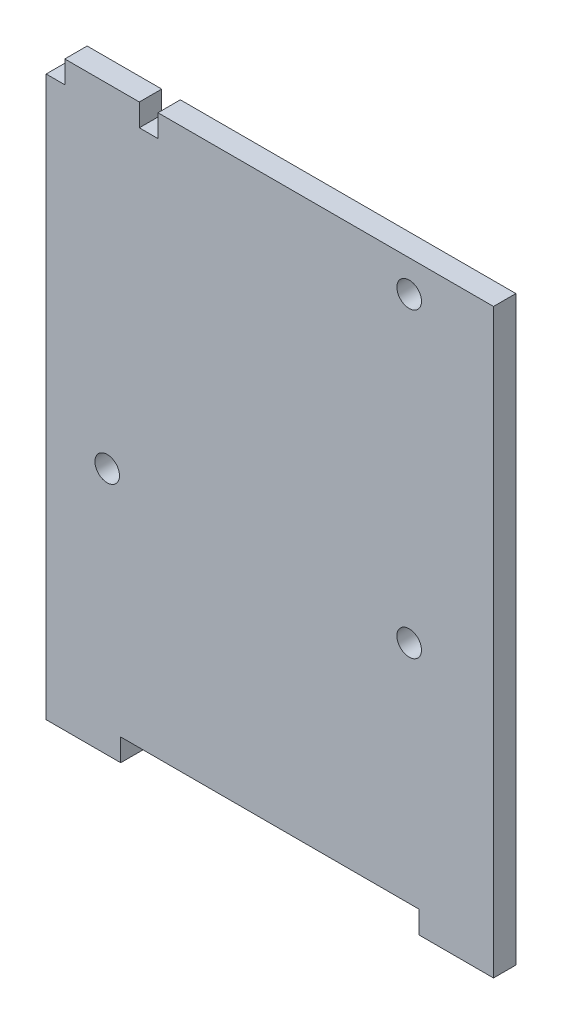
ISO-10303-21;
HEADER;
FILE_DESCRIPTION(('STEP AP214'),'2;1');
FILE_NAME('part.step','',(''),(''),'','','');
FILE_SCHEMA(('AUTOMOTIVE_DESIGN { 1 0 10303 214 1 1 1 1 }'));
ENDSEC;
DATA;
#1=APPLICATION_CONTEXT('core data for automotive mechanical design processes');
#2=APPLICATION_PROTOCOL_DEFINITION('international standard','automotive_design',2000,#1);
#3=PRODUCT_CONTEXT('',#1,'mechanical');
#4=PRODUCT('Part','Part','',(#3));
#5=PRODUCT_RELATED_PRODUCT_CATEGORY('part','',(#4));
#6=PRODUCT_DEFINITION_FORMATION('','',#4);
#7=PRODUCT_DEFINITION_CONTEXT('part definition',#1,'design');
#8=PRODUCT_DEFINITION('design','',#6,#7);
#9=PRODUCT_DEFINITION_SHAPE('','',#8);
#10=(LENGTH_UNIT() NAMED_UNIT(*) SI_UNIT(.MILLI.,.METRE.));
#11=(NAMED_UNIT(*) PLANE_ANGLE_UNIT() SI_UNIT($,.RADIAN.));
#12=(NAMED_UNIT(*) SI_UNIT($,.STERADIAN.) SOLID_ANGLE_UNIT());
#13=UNCERTAINTY_MEASURE_WITH_UNIT(LENGTH_MEASURE(1.E-05),#10,'distance_accuracy_value','');
#14=(GEOMETRIC_REPRESENTATION_CONTEXT(3) GLOBAL_UNCERTAINTY_ASSIGNED_CONTEXT((#13)) GLOBAL_UNIT_ASSIGNED_CONTEXT((#10,
#11,#12)) REPRESENTATION_CONTEXT('',''));
#15=CARTESIAN_POINT('',(0.,0.,0.));
#16=DIRECTION('',(0.,0.,1.));
#17=DIRECTION('',(1.,0.,0.));
#18=AXIS2_PLACEMENT_3D('',#15,#16,#17);
#19=CARTESIAN_POINT('',(20.,75.,1.5));
#20=DIRECTION('',(0.,-1.,0.));
#21=DIRECTION('',(0.,0.,-1.));
#22=AXIS2_PLACEMENT_3D('',#19,#20,#21);
#23=PLANE('',#22);
#24=DIRECTION('',(-1.,0.,0.));
#25=VECTOR('',#24,1.);
#26=CARTESIAN_POINT('',(20.,75.,1.5));
#27=LINE('',#26,#25);
#28=CARTESIAN_POINT('',(32.5,75.,1.5));
#29=VERTEX_POINT('',#28);
#30=CARTESIAN_POINT('',(22.5,75.,1.5));
#31=VERTEX_POINT('',#30);
#32=EDGE_CURVE('E246',#29,#31,#27,.T.);
#33=ORIENTED_EDGE('',*,*,#32,.F.);
#34=DIRECTION('',(0.,0.,1.));
#35=VECTOR('',#34,1.);
#36=CARTESIAN_POINT('',(32.5,75.,-1.50005));
#37=LINE('',#36,#35);
#38=CARTESIAN_POINT('',(32.5,75.,-1.5));
#39=VERTEX_POINT('',#38);
#40=EDGE_CURVE('E160',#39,#29,#37,.T.);
#41=ORIENTED_EDGE('',*,*,#40,.F.);
#42=DIRECTION('',(-1.,0.,0.));
#43=VECTOR('',#42,1.);
#44=CARTESIAN_POINT('',(20.,75.,-1.5));
#45=LINE('',#44,#43);
#46=CARTESIAN_POINT('',(22.5,75.,-1.5));
#47=VERTEX_POINT('',#46);
#48=EDGE_CURVE('E243',#39,#47,#45,.T.);
#49=ORIENTED_EDGE('',*,*,#48,.T.);
#50=DIRECTION('',(0.,0.,1.));
#51=VECTOR('',#50,1.);
#52=CARTESIAN_POINT('',(22.5,75.,-1.50005));
#53=LINE('',#52,#51);
#54=EDGE_CURVE('E180',#47,#31,#53,.T.);
#55=ORIENTED_EDGE('',*,*,#54,.T.);
#56=EDGE_LOOP('',(#33,#41,#49,#55));
#57=FACE_BOUND('',#56,.T.);
#58=ADVANCED_FACE('F46',(#57),#23,.F.);
#59=CARTESIAN_POINT('',(20.,0.,1.5));
#60=DIRECTION('',(0.,1.,0.));
#61=DIRECTION('',(0.,0.,1.));
#62=AXIS2_PLACEMENT_3D('',#59,#60,#61);
#63=PLANE('',#62);
#64=DIRECTION('',(0.,0.,-1.));
#65=VECTOR('',#64,1.);
#66=CARTESIAN_POINT('',(70.,0.,1.5));
#67=LINE('',#66,#65);
#68=CARTESIAN_POINT('',(70.,0.,1.5));
#69=VERTEX_POINT('',#68);
#70=CARTESIAN_POINT('',(70.,0.,-1.5));
#71=VERTEX_POINT('',#70);
#72=EDGE_CURVE('E201',#69,#71,#67,.T.);
#73=ORIENTED_EDGE('',*,*,#72,.F.);
#74=DIRECTION('',(1.,0.,0.));
#75=VECTOR('',#74,1.);
#76=CARTESIAN_POINT('',(20.,0.,1.5));
#77=LINE('',#76,#75);
#78=CARTESIAN_POINT('',(30.,0.,1.5));
#79=VERTEX_POINT('',#78);
#80=EDGE_CURVE('E219',#79,#69,#77,.T.);
#81=ORIENTED_EDGE('',*,*,#80,.F.);
#82=DIRECTION('',(0.,0.,-1.));
#83=VECTOR('',#82,1.);
#84=CARTESIAN_POINT('',(30.,0.,1.5));
#85=LINE('',#84,#83);
#86=CARTESIAN_POINT('',(30.,0.,-1.5));
#87=VERTEX_POINT('',#86);
#88=EDGE_CURVE('E215',#79,#87,#85,.T.);
#89=ORIENTED_EDGE('',*,*,#88,.T.);
#90=DIRECTION('',(1.,0.,0.));
#91=VECTOR('',#90,1.);
#92=CARTESIAN_POINT('',(20.,0.,-1.5));
#93=LINE('',#92,#91);
#94=EDGE_CURVE('E255',#87,#71,#93,.T.);
#95=ORIENTED_EDGE('',*,*,#94,.T.);
#96=EDGE_LOOP('',(#73,#81,#89,#95));
#97=FACE_BOUND('',#96,.T.);
#98=ADVANCED_FACE('F287',(#97),#63,.F.);
#99=CARTESIAN_POINT('',(20.,0.,1.5));
#100=DIRECTION('',(1.,0.,0.));
#101=DIRECTION('',(0.,0.,-1.));
#102=AXIS2_PLACEMENT_3D('',#99,#100,#101);
#103=PLANE('',#102);
#104=DIRECTION('',(0.,-1.,0.));
#105=VECTOR('',#104,1.);
#106=CARTESIAN_POINT('',(20.,0.,1.5));
#107=LINE('',#106,#105);
#108=CARTESIAN_POINT('',(20.,72.,1.5));
#109=VERTEX_POINT('',#108);
#110=CARTESIAN_POINT('',(20.,-3.,1.5));
#111=VERTEX_POINT('',#110);
#112=EDGE_CURVE('E264',#109,#111,#107,.T.);
#113=ORIENTED_EDGE('',*,*,#112,.F.);
#114=DIRECTION('',(0.,0.,1.));
#115=VECTOR('',#114,1.);
#116=CARTESIAN_POINT('',(20.,72.,-1.50005));
#117=LINE('',#116,#115);
#118=CARTESIAN_POINT('',(20.,72.,-1.5));
#119=VERTEX_POINT('',#118);
#120=EDGE_CURVE('E179',#119,#109,#117,.T.);
#121=ORIENTED_EDGE('',*,*,#120,.F.);
#122=DIRECTION('',(0.,-1.,0.));
#123=VECTOR('',#122,1.);
#124=CARTESIAN_POINT('',(20.,0.,-1.5));
#125=LINE('',#124,#123);
#126=CARTESIAN_POINT('',(20.,-3.,-1.5));
#127=VERTEX_POINT('',#126);
#128=EDGE_CURVE('E253',#119,#127,#125,.T.);
#129=ORIENTED_EDGE('',*,*,#128,.T.);
#130=DIRECTION('',(0.,0.,-1.));
#131=VECTOR('',#130,1.);
#132=CARTESIAN_POINT('',(20.,-3.,1.5));
#133=LINE('',#132,#131);
#134=EDGE_CURVE('E301',#111,#127,#133,.T.);
#135=ORIENTED_EDGE('',*,*,#134,.F.);
#136=EDGE_LOOP('',(#113,#121,#129,#135));
#137=FACE_BOUND('',#136,.T.);
#138=ADVANCED_FACE('F48',(#137),#103,.F.);
#139=CARTESIAN_POINT('',(80.,0.,1.5));
#140=DIRECTION('',(-1.,0.,0.));
#141=DIRECTION('',(0.,0.,1.));
#142=AXIS2_PLACEMENT_3D('',#139,#140,#141);
#143=PLANE('',#142);
#144=DIRECTION('',(0.,1.,0.));
#145=VECTOR('',#144,1.);
#146=CARTESIAN_POINT('',(80.,0.,-1.5));
#147=LINE('',#146,#145);
#148=CARTESIAN_POINT('',(80.,-3.,-1.5));
#149=VERTEX_POINT('',#148);
#150=CARTESIAN_POINT('',(80.,75.,-1.5));
#151=VERTEX_POINT('',#150);
#152=EDGE_CURVE('E259',#149,#151,#147,.T.);
#153=ORIENTED_EDGE('',*,*,#152,.T.);
#154=DIRECTION('',(0.,0.,-1.));
#155=VECTOR('',#154,1.);
#156=CARTESIAN_POINT('',(80.,75.,1.5));
#157=LINE('',#156,#155);
#158=CARTESIAN_POINT('',(80.,75.,1.5));
#159=VERTEX_POINT('',#158);
#160=EDGE_CURVE('E231',#159,#151,#157,.T.);
#161=ORIENTED_EDGE('',*,*,#160,.F.);
#162=DIRECTION('',(0.,1.,0.));
#163=VECTOR('',#162,1.);
#164=CARTESIAN_POINT('',(80.,0.,1.5));
#165=LINE('',#164,#163);
#166=CARTESIAN_POINT('',(80.,-3.,1.5));
#167=VERTEX_POINT('',#166);
#168=EDGE_CURVE('E249',#167,#159,#165,.T.);
#169=ORIENTED_EDGE('',*,*,#168,.F.);
#170=DIRECTION('',(0.,0.,-1.));
#171=VECTOR('',#170,1.);
#172=CARTESIAN_POINT('',(80.,-3.,1.5));
#173=LINE('',#172,#171);
#174=EDGE_CURVE('E192',#167,#149,#173,.T.);
#175=ORIENTED_EDGE('',*,*,#174,.T.);
#176=EDGE_LOOP('',(#153,#161,#169,#175));
#177=FACE_BOUND('',#176,.T.);
#178=ADVANCED_FACE('F269',(#177),#143,.F.);
#179=CARTESIAN_POINT('',(35.,75.,-1.5));
#180=VERTEX_POINT('',#179);
#181=EDGE_CURVE('E263',#151,#180,#45,.T.);
#182=ORIENTED_EDGE('',*,*,#181,.T.);
#183=DIRECTION('',(0.,0.,1.));
#184=VECTOR('',#183,1.);
#185=CARTESIAN_POINT('',(35.,75.,-1.50005));
#186=LINE('',#185,#184);
#187=CARTESIAN_POINT('',(35.,75.,1.5));
#188=VERTEX_POINT('',#187);
#189=EDGE_CURVE('E171',#180,#188,#186,.T.);
#190=ORIENTED_EDGE('',*,*,#189,.T.);
#191=EDGE_CURVE('E248',#159,#188,#27,.T.);
#192=ORIENTED_EDGE('',*,*,#191,.F.);
#193=ORIENTED_EDGE('',*,*,#160,.T.);
#194=EDGE_LOOP('',(#182,#190,#192,#193));
#195=FACE_BOUND('',#194,.T.);
#196=ADVANCED_FACE('F273',(#195),#23,.F.);
#197=CARTESIAN_POINT('',(0.,0.,1.5));
#198=DIRECTION('',(0.,0.,-1.));
#199=DIRECTION('',(-1.,0.,0.));
#200=AXIS2_PLACEMENT_3D('',#197,#198,#199);
#201=PLANE('',#200);
#202=CARTESIAN_POINT('',(68.6907786235774,70.7606042997696,1.5));
#203=DIRECTION('',(0.,0.,1.));
#204=DIRECTION('',(1.,0.,0.));
#205=AXIS2_PLACEMENT_3D('',#202,#203,#204);
#206=CIRCLE('',#205,1.65);
#207=CARTESIAN_POINT('',(70.3407786235774,70.7606042997696,1.5));
#208=VERTEX_POINT('',#207);
#209=EDGE_CURVE('E305',#208,#208,#206,.T.);
#210=ORIENTED_EDGE('',*,*,#209,.F.);
#211=EDGE_LOOP('',(#210));
#212=FACE_BOUND('',#211,.T.);
#213=CARTESIAN_POINT('',(68.6907786235773,30.2606042997696,1.5));
#214=DIRECTION('',(0.,0.,1.));
#215=DIRECTION('',(1.,0.,0.));
#216=AXIS2_PLACEMENT_3D('',#213,#214,#215);
#217=CIRCLE('',#216,1.65);
#218=CARTESIAN_POINT('',(70.3407786235773,30.2606042997696,1.5));
#219=VERTEX_POINT('',#218);
#220=EDGE_CURVE('E312',#219,#219,#217,.T.);
#221=ORIENTED_EDGE('',*,*,#220,.F.);
#222=EDGE_LOOP('',(#221));
#223=FACE_BOUND('',#222,.T.);
#224=CARTESIAN_POINT('',(28.1907786235773,30.2606042997699,1.5));
#225=DIRECTION('',(0.,0.,1.));
#226=DIRECTION('',(1.,0.,0.));
#227=AXIS2_PLACEMENT_3D('',#224,#225,#226);
#228=CIRCLE('',#227,1.65);
#229=CARTESIAN_POINT('',(29.8407786235773,30.2606042997699,1.5));
#230=VERTEX_POINT('',#229);
#231=EDGE_CURVE('E318',#230,#230,#228,.T.);
#232=ORIENTED_EDGE('',*,*,#231,.F.);
#233=EDGE_LOOP('',(#232));
#234=FACE_BOUND('',#233,.T.);
#235=DIRECTION('',(1.,0.,0.));
#236=VECTOR('',#235,1.);
#237=CARTESIAN_POINT('',(32.5,72.,1.5));
#238=LINE('',#237,#236);
#239=CARTESIAN_POINT('',(32.5,72.,1.5));
#240=VERTEX_POINT('',#239);
#241=CARTESIAN_POINT('',(35.,72.,1.5));
#242=VERTEX_POINT('',#241);
#243=EDGE_CURVE('E148',#240,#242,#238,.T.);
#244=ORIENTED_EDGE('',*,*,#243,.F.);
#245=DIRECTION('',(0.,-1.,0.));
#246=VECTOR('',#245,1.);
#247=CARTESIAN_POINT('',(32.5,75.,1.5));
#248=LINE('',#247,#246);
#249=EDGE_CURVE('E157',#29,#240,#248,.T.);
#250=ORIENTED_EDGE('',*,*,#249,.F.);
#251=ORIENTED_EDGE('',*,*,#32,.T.);
#252=DIRECTION('',(0.,1.,0.));
#253=VECTOR('',#252,1.);
#254=CARTESIAN_POINT('',(22.5,75.,1.5));
#255=LINE('',#254,#253);
#256=CARTESIAN_POINT('',(22.5,72.,1.5));
#257=VERTEX_POINT('',#256);
#258=EDGE_CURVE('E176',#257,#31,#255,.T.);
#259=ORIENTED_EDGE('',*,*,#258,.F.);
#260=DIRECTION('',(1.,0.,0.));
#261=VECTOR('',#260,1.);
#262=CARTESIAN_POINT('',(20.,72.,1.5));
#263=LINE('',#262,#261);
#264=EDGE_CURVE('E170',#109,#257,#263,.T.);
#265=ORIENTED_EDGE('',*,*,#264,.F.);
#266=ORIENTED_EDGE('',*,*,#112,.T.);
#267=DIRECTION('',(1.,0.,0.));
#268=VECTOR('',#267,1.);
#269=CARTESIAN_POINT('',(20.,-3.,1.5));
#270=LINE('',#269,#268);
#271=CARTESIAN_POINT('',(30.,-3.,1.5));
#272=VERTEX_POINT('',#271);
#273=EDGE_CURVE('E205',#111,#272,#270,.T.);
#274=ORIENTED_EDGE('',*,*,#273,.T.);
#275=DIRECTION('',(0.,1.,0.));
#276=VECTOR('',#275,1.);
#277=CARTESIAN_POINT('',(30.,0.,1.5));
#278=LINE('',#277,#276);
#279=EDGE_CURVE('E207',#272,#79,#278,.T.);
#280=ORIENTED_EDGE('',*,*,#279,.T.);
#281=ORIENTED_EDGE('',*,*,#80,.T.);
#282=DIRECTION('',(0.,-1.,0.));
#283=VECTOR('',#282,1.);
#284=CARTESIAN_POINT('',(70.,0.,1.5));
#285=LINE('',#284,#283);
#286=CARTESIAN_POINT('',(70.,-3.,1.5));
#287=VERTEX_POINT('',#286);
#288=EDGE_CURVE('E186',#69,#287,#285,.T.);
#289=ORIENTED_EDGE('',*,*,#288,.T.);
#290=DIRECTION('',(1.,0.,0.));
#291=VECTOR('',#290,1.);
#292=CARTESIAN_POINT('',(80.,-3.,1.5));
#293=LINE('',#292,#291);
#294=EDGE_CURVE('E188',#287,#167,#293,.T.);
#295=ORIENTED_EDGE('',*,*,#294,.T.);
#296=ORIENTED_EDGE('',*,*,#168,.T.);
#297=ORIENTED_EDGE('',*,*,#191,.T.);
#298=DIRECTION('',(0.,1.,0.));
#299=VECTOR('',#298,1.);
#300=CARTESIAN_POINT('',(35.,75.,1.5));
#301=LINE('',#300,#299);
#302=EDGE_CURVE('E154',#242,#188,#301,.T.);
#303=ORIENTED_EDGE('',*,*,#302,.F.);
#304=EDGE_LOOP('',(#244,#250,#251,#259,#265,#266,#274,#280,#281,#289,#295,#296,#297,#303));
#305=FACE_BOUND('',#304,.T.);
#306=ADVANCED_FACE('F164',(#212,#223,#234,#305),#201,.F.);
#307=CARTESIAN_POINT('',(0.,0.,-1.5));
#308=DIRECTION('',(0.,0.,-1.));
#309=DIRECTION('',(-1.,0.,0.));
#310=AXIS2_PLACEMENT_3D('',#307,#308,#309);
#311=PLANE('',#310);
#312=DIRECTION('',(0.,1.,0.));
#313=VECTOR('',#312,1.);
#314=CARTESIAN_POINT('',(32.5,0.,-1.5));
#315=LINE('',#314,#313);
#316=CARTESIAN_POINT('',(32.5,72.,-1.5));
#317=VERTEX_POINT('',#316);
#318=EDGE_CURVE('E13',#317,#39,#315,.T.);
#319=ORIENTED_EDGE('',*,*,#318,.F.);
#320=DIRECTION('',(-1.,0.,0.));
#321=VECTOR('',#320,1.);
#322=CARTESIAN_POINT('',(3.99680288865057E-13,72.0000000000002,-1.5));
#323=LINE('',#322,#321);
#324=CARTESIAN_POINT('',(35.,72.,-1.5));
#325=VERTEX_POINT('',#324);
#326=EDGE_CURVE('E151',#325,#317,#323,.T.);
#327=ORIENTED_EDGE('',*,*,#326,.F.);
#328=DIRECTION('',(0.,-1.,0.));
#329=VECTOR('',#328,1.);
#330=CARTESIAN_POINT('',(35.,0.,-1.5));
#331=LINE('',#330,#329);
#332=EDGE_CURVE('E54',#180,#325,#331,.T.);
#333=ORIENTED_EDGE('',*,*,#332,.F.);
#334=ORIENTED_EDGE('',*,*,#181,.F.);
#335=ORIENTED_EDGE('',*,*,#152,.F.);
#336=DIRECTION('',(1.,0.,0.));
#337=VECTOR('',#336,1.);
#338=CARTESIAN_POINT('',(80.,-3.,-1.5));
#339=LINE('',#338,#337);
#340=CARTESIAN_POINT('',(70.,-3.,-1.5));
#341=VERTEX_POINT('',#340);
#342=EDGE_CURVE('E189',#341,#149,#339,.T.);
#343=ORIENTED_EDGE('',*,*,#342,.F.);
#344=DIRECTION('',(0.,-1.,0.));
#345=VECTOR('',#344,1.);
#346=CARTESIAN_POINT('',(70.,0.,-1.5));
#347=LINE('',#346,#345);
#348=EDGE_CURVE('E183',#71,#341,#347,.T.);
#349=ORIENTED_EDGE('',*,*,#348,.F.);
#350=ORIENTED_EDGE('',*,*,#94,.F.);
#351=DIRECTION('',(0.,1.,0.));
#352=VECTOR('',#351,1.);
#353=CARTESIAN_POINT('',(30.,0.,-1.5));
#354=LINE('',#353,#352);
#355=CARTESIAN_POINT('',(30.,-3.,-1.5));
#356=VERTEX_POINT('',#355);
#357=EDGE_CURVE('E208',#356,#87,#354,.T.);
#358=ORIENTED_EDGE('',*,*,#357,.F.);
#359=DIRECTION('',(1.,0.,0.));
#360=VECTOR('',#359,1.);
#361=CARTESIAN_POINT('',(20.,-3.,-1.5));
#362=LINE('',#361,#360);
#363=EDGE_CURVE('E204',#127,#356,#362,.T.);
#364=ORIENTED_EDGE('',*,*,#363,.F.);
#365=ORIENTED_EDGE('',*,*,#128,.F.);
#366=DIRECTION('',(-1.,0.,0.));
#367=VECTOR('',#366,1.);
#368=CARTESIAN_POINT('',(0.,72.,-1.5));
#369=LINE('',#368,#367);
#370=CARTESIAN_POINT('',(22.5,72.,-1.5));
#371=VERTEX_POINT('',#370);
#372=EDGE_CURVE('E228',#371,#119,#369,.T.);
#373=ORIENTED_EDGE('',*,*,#372,.F.);
#374=DIRECTION('',(0.,-1.,0.));
#375=VECTOR('',#374,1.);
#376=CARTESIAN_POINT('',(22.5,0.,-1.5));
#377=LINE('',#376,#375);
#378=EDGE_CURVE('E230',#47,#371,#377,.T.);
#379=ORIENTED_EDGE('',*,*,#378,.F.);
#380=ORIENTED_EDGE('',*,*,#48,.F.);
#381=EDGE_LOOP('',(#319,#327,#333,#334,#335,#343,#349,#350,#358,#364,#365,#373,#379,#380));
#382=FACE_BOUND('',#381,.T.);
#383=CARTESIAN_POINT('',(68.6907786235774,70.7606042997696,-1.5));
#384=DIRECTION('',(0.,0.,1.));
#385=DIRECTION('',(1.,0.,0.));
#386=AXIS2_PLACEMENT_3D('',#383,#384,#385);
#387=CIRCLE('',#386,1.65);
#388=CARTESIAN_POINT('',(70.3407786235774,70.7606042997696,-1.5));
#389=VERTEX_POINT('',#388);
#390=EDGE_CURVE('E307',#389,#389,#387,.T.);
#391=ORIENTED_EDGE('',*,*,#390,.T.);
#392=EDGE_LOOP('',(#391));
#393=FACE_BOUND('',#392,.T.);
#394=CARTESIAN_POINT('',(68.6907786235773,30.2606042997696,-1.5));
#395=DIRECTION('',(0.,0.,1.));
#396=DIRECTION('',(1.,0.,0.));
#397=AXIS2_PLACEMENT_3D('',#394,#395,#396);
#398=CIRCLE('',#397,1.65);
#399=CARTESIAN_POINT('',(70.3407786235773,30.2606042997696,-1.5));
#400=VERTEX_POINT('',#399);
#401=EDGE_CURVE('E315',#400,#400,#398,.T.);
#402=ORIENTED_EDGE('',*,*,#401,.T.);
#403=EDGE_LOOP('',(#402));
#404=FACE_BOUND('',#403,.T.);
#405=CARTESIAN_POINT('',(28.1907786235773,30.2606042997699,-1.5));
#406=DIRECTION('',(0.,0.,1.));
#407=DIRECTION('',(1.,0.,0.));
#408=AXIS2_PLACEMENT_3D('',#405,#406,#407);
#409=CIRCLE('',#408,1.65);
#410=CARTESIAN_POINT('',(29.8407786235773,30.2606042997699,-1.5));
#411=VERTEX_POINT('',#410);
#412=EDGE_CURVE('E256',#411,#411,#409,.T.);
#413=ORIENTED_EDGE('',*,*,#412,.T.);
#414=EDGE_LOOP('',(#413));
#415=FACE_BOUND('',#414,.T.);
#416=ADVANCED_FACE('F239',(#382,#393,#404,#415),#311,.T.);
#417=CARTESIAN_POINT('',(28.1907786235773,30.2606042997699,-1.5));
#418=DIRECTION('',(0.,0.,1.));
#419=DIRECTION('',(1.,0.,0.));
#420=AXIS2_PLACEMENT_3D('',#417,#418,#419);
#421=CYLINDRICAL_SURFACE('',#420,1.65);
#422=ORIENTED_EDGE('',*,*,#412,.F.);
#423=EDGE_LOOP('',(#422));
#424=FACE_BOUND('',#423,.T.);
#425=ORIENTED_EDGE('',*,*,#231,.T.);
#426=EDGE_LOOP('',(#425));
#427=FACE_BOUND('',#426,.T.);
#428=ADVANCED_FACE('F326',(#424,#427),#421,.F.);
#429=CARTESIAN_POINT('',(68.6907786235773,30.2606042997696,-1.5));
#430=DIRECTION('',(0.,0.,1.));
#431=DIRECTION('',(1.,0.,0.));
#432=AXIS2_PLACEMENT_3D('',#429,#430,#431);
#433=CYLINDRICAL_SURFACE('',#432,1.65);
#434=ORIENTED_EDGE('',*,*,#401,.F.);
#435=EDGE_LOOP('',(#434));
#436=FACE_BOUND('',#435,.T.);
#437=ORIENTED_EDGE('',*,*,#220,.T.);
#438=EDGE_LOOP('',(#437));
#439=FACE_BOUND('',#438,.T.);
#440=ADVANCED_FACE('F329',(#436,#439),#433,.F.);
#441=CARTESIAN_POINT('',(68.6907786235774,70.7606042997696,-1.5));
#442=DIRECTION('',(0.,0.,1.));
#443=DIRECTION('',(1.,0.,0.));
#444=AXIS2_PLACEMENT_3D('',#441,#442,#443);
#445=CYLINDRICAL_SURFACE('',#444,1.65);
#446=ORIENTED_EDGE('',*,*,#390,.F.);
#447=EDGE_LOOP('',(#446));
#448=FACE_BOUND('',#447,.T.);
#449=ORIENTED_EDGE('',*,*,#209,.T.);
#450=EDGE_LOOP('',(#449));
#451=FACE_BOUND('',#450,.T.);
#452=ADVANCED_FACE('F377',(#448,#451),#445,.F.);
#453=CARTESIAN_POINT('',(20.,-3.,1.5));
#454=DIRECTION('',(0.,1.,0.));
#455=DIRECTION('',(0.,0.,1.));
#456=AXIS2_PLACEMENT_3D('',#453,#454,#455);
#457=PLANE('',#456);
#458=ORIENTED_EDGE('',*,*,#363,.T.);
#459=DIRECTION('',(0.,0.,-1.));
#460=VECTOR('',#459,1.);
#461=CARTESIAN_POINT('',(30.,-3.,1.5));
#462=LINE('',#461,#460);
#463=EDGE_CURVE('E212',#272,#356,#462,.T.);
#464=ORIENTED_EDGE('',*,*,#463,.F.);
#465=ORIENTED_EDGE('',*,*,#273,.F.);
#466=ORIENTED_EDGE('',*,*,#134,.T.);
#467=EDGE_LOOP('',(#458,#464,#465,#466));
#468=FACE_BOUND('',#467,.T.);
#469=ADVANCED_FACE('F302',(#468),#457,.F.);
#470=CARTESIAN_POINT('',(30.,0.,1.5));
#471=DIRECTION('',(-1.,0.,0.));
#472=DIRECTION('',(0.,0.,1.));
#473=AXIS2_PLACEMENT_3D('',#470,#471,#472);
#474=PLANE('',#473);
#475=ORIENTED_EDGE('',*,*,#357,.T.);
#476=ORIENTED_EDGE('',*,*,#88,.F.);
#477=ORIENTED_EDGE('',*,*,#279,.F.);
#478=ORIENTED_EDGE('',*,*,#463,.T.);
#479=EDGE_LOOP('',(#475,#476,#477,#478));
#480=FACE_BOUND('',#479,.T.);
#481=ADVANCED_FACE('F294',(#480),#474,.F.);
#482=CARTESIAN_POINT('',(70.,0.,1.5));
#483=DIRECTION('',(1.,0.,0.));
#484=DIRECTION('',(0.,0.,-1.));
#485=AXIS2_PLACEMENT_3D('',#482,#483,#484);
#486=PLANE('',#485);
#487=ORIENTED_EDGE('',*,*,#348,.T.);
#488=DIRECTION('',(0.,0.,-1.));
#489=VECTOR('',#488,1.);
#490=CARTESIAN_POINT('',(70.,-3.,1.5));
#491=LINE('',#490,#489);
#492=EDGE_CURVE('E198',#287,#341,#491,.T.);
#493=ORIENTED_EDGE('',*,*,#492,.F.);
#494=ORIENTED_EDGE('',*,*,#288,.F.);
#495=ORIENTED_EDGE('',*,*,#72,.T.);
#496=EDGE_LOOP('',(#487,#493,#494,#495));
#497=FACE_BOUND('',#496,.T.);
#498=ADVANCED_FACE('F284',(#497),#486,.F.);
#499=CARTESIAN_POINT('',(80.,-3.,1.5));
#500=DIRECTION('',(0.,1.,0.));
#501=DIRECTION('',(-1.,0.,0.));
#502=AXIS2_PLACEMENT_3D('',#499,#500,#501);
#503=PLANE('',#502);
#504=ORIENTED_EDGE('',*,*,#342,.T.);
#505=ORIENTED_EDGE('',*,*,#174,.F.);
#506=ORIENTED_EDGE('',*,*,#294,.F.);
#507=ORIENTED_EDGE('',*,*,#492,.T.);
#508=EDGE_LOOP('',(#504,#505,#506,#507));
#509=FACE_BOUND('',#508,.T.);
#510=ADVANCED_FACE('F279',(#509),#503,.F.);
#511=CARTESIAN_POINT('',(22.5,75.,-1.50005));
#512=DIRECTION('',(1.,0.,0.));
#513=DIRECTION('',(0.,0.,-1.));
#514=AXIS2_PLACEMENT_3D('',#511,#512,#513);
#515=PLANE('',#514);
#516=ORIENTED_EDGE('',*,*,#378,.T.);
#517=DIRECTION('',(0.,0.,1.));
#518=VECTOR('',#517,1.);
#519=CARTESIAN_POINT('',(22.5,72.,-1.50005));
#520=LINE('',#519,#518);
#521=EDGE_CURVE('E69',#371,#257,#520,.T.);
#522=ORIENTED_EDGE('',*,*,#521,.T.);
#523=ORIENTED_EDGE('',*,*,#258,.T.);
#524=ORIENTED_EDGE('',*,*,#54,.F.);
#525=EDGE_LOOP('',(#516,#522,#523,#524));
#526=FACE_BOUND('',#525,.T.);
#527=ADVANCED_FACE('F359',(#526),#515,.F.);
#528=CARTESIAN_POINT('',(20.,72.,-1.50005));
#529=DIRECTION('',(0.,-1.,0.));
#530=DIRECTION('',(0.,0.,-1.));
#531=AXIS2_PLACEMENT_3D('',#528,#529,#530);
#532=PLANE('',#531);
#533=ORIENTED_EDGE('',*,*,#372,.T.);
#534=ORIENTED_EDGE('',*,*,#120,.T.);
#535=ORIENTED_EDGE('',*,*,#264,.T.);
#536=ORIENTED_EDGE('',*,*,#521,.F.);
#537=EDGE_LOOP('',(#533,#534,#535,#536));
#538=FACE_BOUND('',#537,.T.);
#539=ADVANCED_FACE('F357',(#538),#532,.F.);
#540=CARTESIAN_POINT('',(32.5,75.,-1.50005));
#541=DIRECTION('',(-1.,0.,0.));
#542=DIRECTION('',(0.,0.,1.));
#543=AXIS2_PLACEMENT_3D('',#540,#541,#542);
#544=PLANE('',#543);
#545=ORIENTED_EDGE('',*,*,#318,.T.);
#546=ORIENTED_EDGE('',*,*,#40,.T.);
#547=ORIENTED_EDGE('',*,*,#249,.T.);
#548=DIRECTION('',(0.,0.,1.));
#549=VECTOR('',#548,1.);
#550=CARTESIAN_POINT('',(32.5,72.,-1.50005));
#551=LINE('',#550,#549);
#552=EDGE_CURVE('E144',#317,#240,#551,.T.);
#553=ORIENTED_EDGE('',*,*,#552,.F.);
#554=EDGE_LOOP('',(#545,#546,#547,#553));
#555=FACE_BOUND('',#554,.T.);
#556=ADVANCED_FACE('F158',(#555),#544,.F.);
#557=CARTESIAN_POINT('',(35.,75.,-1.50005));
#558=DIRECTION('',(1.,0.,0.));
#559=DIRECTION('',(0.,0.,-1.));
#560=AXIS2_PLACEMENT_3D('',#557,#558,#559);
#561=PLANE('',#560);
#562=ORIENTED_EDGE('',*,*,#332,.T.);
#563=DIRECTION('',(0.,0.,1.));
#564=VECTOR('',#563,1.);
#565=CARTESIAN_POINT('',(35.,72.,-1.50005));
#566=LINE('',#565,#564);
#567=EDGE_CURVE('E61',#325,#242,#566,.T.);
#568=ORIENTED_EDGE('',*,*,#567,.T.);
#569=ORIENTED_EDGE('',*,*,#302,.T.);
#570=ORIENTED_EDGE('',*,*,#189,.F.);
#571=EDGE_LOOP('',(#562,#568,#569,#570));
#572=FACE_BOUND('',#571,.T.);
#573=ADVANCED_FACE('F235',(#572),#561,.F.);
#574=CARTESIAN_POINT('',(32.5,72.,-1.50005));
#575=DIRECTION('',(0.,-1.,0.));
#576=DIRECTION('',(1.,0.,0.));
#577=AXIS2_PLACEMENT_3D('',#574,#575,#576);
#578=PLANE('',#577);
#579=ORIENTED_EDGE('',*,*,#326,.T.);
#580=ORIENTED_EDGE('',*,*,#552,.T.);
#581=ORIENTED_EDGE('',*,*,#243,.T.);
#582=ORIENTED_EDGE('',*,*,#567,.F.);
#583=EDGE_LOOP('',(#579,#580,#581,#582));
#584=FACE_BOUND('',#583,.T.);
#585=ADVANCED_FACE('F146',(#584),#578,.F.);
#586=CLOSED_SHELL('',(#58,#98,#138,#178,#196,#306,#416,#428,#440,#452,#469,#481,#498,#510,#527,
#539,#556,#573,#585));
#587=MANIFOLD_SOLID_BREP('B2',#586);
#588=ADVANCED_BREP_SHAPE_REPRESENTATION('',(#18,#587),#14);
#589=SHAPE_DEFINITION_REPRESENTATION(#9,#588);
ENDSEC;
END-ISO-10303-21;
